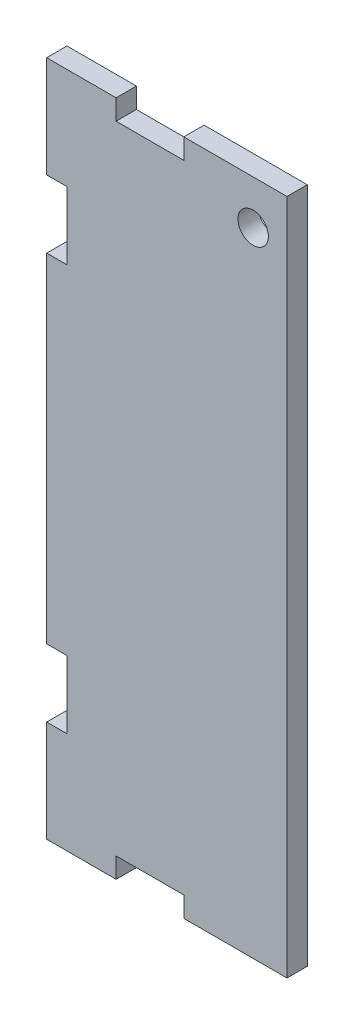
ISO-10303-21;
HEADER;
FILE_DESCRIPTION(('STEP AP214'),'2;1');
FILE_NAME('part.step','',(''),(''),'','','');
FILE_SCHEMA(('AUTOMOTIVE_DESIGN { 1 0 10303 214 1 1 1 1 }'));
ENDSEC;
DATA;
#1=APPLICATION_CONTEXT('core data for automotive mechanical design processes');
#2=APPLICATION_PROTOCOL_DEFINITION('international standard','automotive_design',2000,#1);
#3=PRODUCT_CONTEXT('',#1,'mechanical');
#4=PRODUCT('Part','Part','',(#3));
#5=PRODUCT_RELATED_PRODUCT_CATEGORY('part','',(#4));
#6=PRODUCT_DEFINITION_FORMATION('','',#4);
#7=PRODUCT_DEFINITION_CONTEXT('part definition',#1,'design');
#8=PRODUCT_DEFINITION('design','',#6,#7);
#9=PRODUCT_DEFINITION_SHAPE('','',#8);
#10=(LENGTH_UNIT() NAMED_UNIT(*) SI_UNIT(.MILLI.,.METRE.));
#11=(NAMED_UNIT(*) PLANE_ANGLE_UNIT() SI_UNIT($,.RADIAN.));
#12=(NAMED_UNIT(*) SI_UNIT($,.STERADIAN.) SOLID_ANGLE_UNIT());
#13=UNCERTAINTY_MEASURE_WITH_UNIT(LENGTH_MEASURE(1.E-05),#10,'distance_accuracy_value','');
#14=(GEOMETRIC_REPRESENTATION_CONTEXT(3) GLOBAL_UNCERTAINTY_ASSIGNED_CONTEXT((#13)) GLOBAL_UNIT_ASSIGNED_CONTEXT((#10,
#11,#12)) REPRESENTATION_CONTEXT('',''));
#15=CARTESIAN_POINT('',(0.,0.,0.));
#16=DIRECTION('',(0.,0.,1.));
#17=DIRECTION('',(1.,0.,0.));
#18=AXIS2_PLACEMENT_3D('',#15,#16,#17);
#19=CARTESIAN_POINT('',(0.,-47.,3.));
#20=DIRECTION('',(0.,1.,0.));
#21=DIRECTION('',(0.,0.,1.));
#22=AXIS2_PLACEMENT_3D('',#19,#20,#21);
#23=PLANE('',#22);
#24=DIRECTION('',(1.,0.,0.));
#25=VECTOR('',#24,1.);
#26=CARTESIAN_POINT('',(0.,-47.,0.));
#27=LINE('',#26,#25);
#28=CARTESIAN_POINT('',(-5.,-47.,0.));
#29=VERTEX_POINT('',#28);
#30=CARTESIAN_POINT('',(5.,-47.,0.));
#31=VERTEX_POINT('',#30);
#32=EDGE_CURVE('E229',#29,#31,#27,.T.);
#33=ORIENTED_EDGE('',*,*,#32,.T.);
#34=DIRECTION('',(0.,0.,-1.));
#35=VECTOR('',#34,1.);
#36=CARTESIAN_POINT('',(5.,-47.,3.));
#37=LINE('',#36,#35);
#38=CARTESIAN_POINT('',(5.,-47.,3.));
#39=VERTEX_POINT('',#38);
#40=EDGE_CURVE('E11',#39,#31,#37,.T.);
#41=ORIENTED_EDGE('',*,*,#40,.F.);
#42=DIRECTION('',(1.,0.,0.));
#43=VECTOR('',#42,1.);
#44=CARTESIAN_POINT('',(0.,-47.,3.));
#45=LINE('',#44,#43);
#46=CARTESIAN_POINT('',(-5.,-47.,3.));
#47=VERTEX_POINT('',#46);
#48=EDGE_CURVE('E221',#47,#39,#45,.T.);
#49=ORIENTED_EDGE('',*,*,#48,.F.);
#50=DIRECTION('',(0.,0.,-1.));
#51=VECTOR('',#50,1.);
#52=CARTESIAN_POINT('',(-5.,-47.,3.));
#53=LINE('',#52,#51);
#54=EDGE_CURVE('E205',#47,#29,#53,.T.);
#55=ORIENTED_EDGE('',*,*,#54,.T.);
#56=EDGE_LOOP('',(#33,#41,#49,#55));
#57=FACE_BOUND('',#56,.T.);
#58=ADVANCED_FACE('F41',(#57),#23,.F.);
#59=CARTESIAN_POINT('',(4.99999999999997,0.,3.));
#60=DIRECTION('',(1.,0.,0.));
#61=DIRECTION('',(0.,1.,0.));
#62=AXIS2_PLACEMENT_3D('',#59,#60,#61);
#63=PLANE('',#62);
#64=DIRECTION('',(0.,-1.,0.));
#65=VECTOR('',#64,1.);
#66=CARTESIAN_POINT('',(4.99999999999997,0.,0.));
#67=LINE('',#66,#65);
#68=CARTESIAN_POINT('',(5.,-50.,0.));
#69=VERTEX_POINT('',#68);
#70=EDGE_CURVE('E282',#31,#69,#67,.T.);
#71=ORIENTED_EDGE('',*,*,#70,.T.);
#72=DIRECTION('',(0.,0.,-1.));
#73=VECTOR('',#72,1.);
#74=CARTESIAN_POINT('',(5.,-50.,3.));
#75=LINE('',#74,#73);
#76=CARTESIAN_POINT('',(5.,-50.,3.));
#77=VERTEX_POINT('',#76);
#78=EDGE_CURVE('E50',#77,#69,#75,.T.);
#79=ORIENTED_EDGE('',*,*,#78,.F.);
#80=DIRECTION('',(0.,-1.,0.));
#81=VECTOR('',#80,1.);
#82=CARTESIAN_POINT('',(4.99999999999997,0.,3.));
#83=LINE('',#82,#81);
#84=EDGE_CURVE('E132',#39,#77,#83,.T.);
#85=ORIENTED_EDGE('',*,*,#84,.F.);
#86=ORIENTED_EDGE('',*,*,#40,.T.);
#87=EDGE_LOOP('',(#71,#79,#85,#86));
#88=FACE_BOUND('',#87,.T.);
#89=ADVANCED_FACE('F271',(#88),#63,.F.);
#90=CARTESIAN_POINT('',(0.,-50.,3.));
#91=DIRECTION('',(0.,1.,0.));
#92=DIRECTION('',(0.,0.,1.));
#93=AXIS2_PLACEMENT_3D('',#90,#91,#92);
#94=PLANE('',#93);
#95=DIRECTION('',(1.,0.,0.));
#96=VECTOR('',#95,1.);
#97=CARTESIAN_POINT('',(0.,-50.,0.));
#98=LINE('',#97,#96);
#99=CARTESIAN_POINT('',(20.25,-50.,0.));
#100=VERTEX_POINT('',#99);
#101=EDGE_CURVE('E285',#69,#100,#98,.T.);
#102=ORIENTED_EDGE('',*,*,#101,.T.);
#103=DIRECTION('',(0.,0.,-1.));
#104=VECTOR('',#103,1.);
#105=CARTESIAN_POINT('',(20.25,-50.,3.));
#106=LINE('',#105,#104);
#107=CARTESIAN_POINT('',(20.25,-50.,3.));
#108=VERTEX_POINT('',#107);
#109=EDGE_CURVE('E225',#108,#100,#106,.T.);
#110=ORIENTED_EDGE('',*,*,#109,.F.);
#111=DIRECTION('',(1.,0.,0.));
#112=VECTOR('',#111,1.);
#113=CARTESIAN_POINT('',(0.,-50.,3.));
#114=LINE('',#113,#112);
#115=EDGE_CURVE('E203',#77,#108,#114,.T.);
#116=ORIENTED_EDGE('',*,*,#115,.F.);
#117=ORIENTED_EDGE('',*,*,#78,.T.);
#118=EDGE_LOOP('',(#102,#110,#116,#117));
#119=FACE_BOUND('',#118,.T.);
#120=ADVANCED_FACE('F276',(#119),#94,.F.);
#121=CARTESIAN_POINT('',(0.,50.,3.));
#122=DIRECTION('',(0.,1.,0.));
#123=DIRECTION('',(0.,0.,1.));
#124=AXIS2_PLACEMENT_3D('',#121,#122,#123);
#125=PLANE('',#124);
#126=DIRECTION('',(1.,0.,0.));
#127=VECTOR('',#126,1.);
#128=CARTESIAN_POINT('',(0.,50.,0.));
#129=LINE('',#128,#127);
#130=CARTESIAN_POINT('',(5.,50.,0.));
#131=VERTEX_POINT('',#130);
#132=CARTESIAN_POINT('',(20.25,50.,0.));
#133=VERTEX_POINT('',#132);
#134=EDGE_CURVE('E292',#131,#133,#129,.T.);
#135=ORIENTED_EDGE('',*,*,#134,.F.);
#136=DIRECTION('',(0.,0.,-1.));
#137=VECTOR('',#136,1.);
#138=CARTESIAN_POINT('',(5.,50.,3.));
#139=LINE('',#138,#137);
#140=CARTESIAN_POINT('',(5.,50.,3.));
#141=VERTEX_POINT('',#140);
#142=EDGE_CURVE('E379',#141,#131,#139,.T.);
#143=ORIENTED_EDGE('',*,*,#142,.F.);
#144=DIRECTION('',(1.,0.,0.));
#145=VECTOR('',#144,1.);
#146=CARTESIAN_POINT('',(0.,50.,3.));
#147=LINE('',#146,#145);
#148=CARTESIAN_POINT('',(20.25,50.,3.));
#149=VERTEX_POINT('',#148);
#150=EDGE_CURVE('E211',#141,#149,#147,.T.);
#151=ORIENTED_EDGE('',*,*,#150,.T.);
#152=DIRECTION('',(0.,0.,-1.));
#153=VECTOR('',#152,1.);
#154=CARTESIAN_POINT('',(20.25,50.,3.));
#155=LINE('',#154,#153);
#156=EDGE_CURVE('E230',#149,#133,#155,.T.);
#157=ORIENTED_EDGE('',*,*,#156,.T.);
#158=EDGE_LOOP('',(#135,#143,#151,#157));
#159=FACE_BOUND('',#158,.T.);
#160=ADVANCED_FACE('F392',(#159),#125,.T.);
#161=CARTESIAN_POINT('',(4.99999999999994,0.,3.));
#162=DIRECTION('',(-1.,0.,0.));
#163=DIRECTION('',(0.,-1.,0.));
#164=AXIS2_PLACEMENT_3D('',#161,#162,#163);
#165=PLANE('',#164);
#166=DIRECTION('',(0.,1.,0.));
#167=VECTOR('',#166,1.);
#168=CARTESIAN_POINT('',(4.99999999999994,0.,0.));
#169=LINE('',#168,#167);
#170=CARTESIAN_POINT('',(5.,47.,0.));
#171=VERTEX_POINT('',#170);
#172=EDGE_CURVE('E296',#171,#131,#169,.T.);
#173=ORIENTED_EDGE('',*,*,#172,.F.);
#174=DIRECTION('',(0.,0.,-1.));
#175=VECTOR('',#174,1.);
#176=CARTESIAN_POINT('',(5.,47.,3.));
#177=LINE('',#176,#175);
#178=CARTESIAN_POINT('',(5.,47.,3.));
#179=VERTEX_POINT('',#178);
#180=EDGE_CURVE('E376',#179,#171,#177,.T.);
#181=ORIENTED_EDGE('',*,*,#180,.F.);
#182=DIRECTION('',(0.,1.,0.));
#183=VECTOR('',#182,1.);
#184=CARTESIAN_POINT('',(4.99999999999994,0.,3.));
#185=LINE('',#184,#183);
#186=EDGE_CURVE('E219',#179,#141,#185,.T.);
#187=ORIENTED_EDGE('',*,*,#186,.T.);
#188=ORIENTED_EDGE('',*,*,#142,.T.);
#189=EDGE_LOOP('',(#173,#181,#187,#188));
#190=FACE_BOUND('',#189,.T.);
#191=ADVANCED_FACE('F402',(#190),#165,.T.);
#192=CARTESIAN_POINT('',(0.,47.,3.));
#193=DIRECTION('',(0.,1.,0.));
#194=DIRECTION('',(-1.,0.,0.));
#195=AXIS2_PLACEMENT_3D('',#192,#193,#194);
#196=PLANE('',#195);
#197=DIRECTION('',(1.,0.,0.));
#198=VECTOR('',#197,1.);
#199=CARTESIAN_POINT('',(0.,47.,0.));
#200=LINE('',#199,#198);
#201=CARTESIAN_POINT('',(-5.,47.,0.));
#202=VERTEX_POINT('',#201);
#203=EDGE_CURVE('E301',#202,#171,#200,.T.);
#204=ORIENTED_EDGE('',*,*,#203,.F.);
#205=DIRECTION('',(0.,0.,-1.));
#206=VECTOR('',#205,1.);
#207=CARTESIAN_POINT('',(-5.,47.,3.));
#208=LINE('',#207,#206);
#209=CARTESIAN_POINT('',(-5.,47.,3.));
#210=VERTEX_POINT('',#209);
#211=EDGE_CURVE('E373',#210,#202,#208,.T.);
#212=ORIENTED_EDGE('',*,*,#211,.F.);
#213=DIRECTION('',(1.,0.,0.));
#214=VECTOR('',#213,1.);
#215=CARTESIAN_POINT('',(0.,47.,3.));
#216=LINE('',#215,#214);
#217=EDGE_CURVE('E404',#210,#179,#216,.T.);
#218=ORIENTED_EDGE('',*,*,#217,.T.);
#219=ORIENTED_EDGE('',*,*,#180,.T.);
#220=EDGE_LOOP('',(#204,#212,#218,#219));
#221=FACE_BOUND('',#220,.T.);
#222=ADVANCED_FACE('F499',(#221),#196,.T.);
#223=CARTESIAN_POINT('',(-5.00000000000006,0.,3.));
#224=DIRECTION('',(1.,0.,0.));
#225=DIRECTION('',(0.,1.,0.));
#226=AXIS2_PLACEMENT_3D('',#223,#224,#225);
#227=PLANE('',#226);
#228=DIRECTION('',(0.,-1.,0.));
#229=VECTOR('',#228,1.);
#230=CARTESIAN_POINT('',(-5.00000000000006,0.,0.));
#231=LINE('',#230,#229);
#232=CARTESIAN_POINT('',(-5.,50.,0.));
#233=VERTEX_POINT('',#232);
#234=EDGE_CURVE('E305',#233,#202,#231,.T.);
#235=ORIENTED_EDGE('',*,*,#234,.F.);
#236=DIRECTION('',(0.,0.,-1.));
#237=VECTOR('',#236,1.);
#238=CARTESIAN_POINT('',(-5.,50.,3.));
#239=LINE('',#238,#237);
#240=CARTESIAN_POINT('',(-5.,50.,3.));
#241=VERTEX_POINT('',#240);
#242=EDGE_CURVE('E370',#241,#233,#239,.T.);
#243=ORIENTED_EDGE('',*,*,#242,.F.);
#244=DIRECTION('',(0.,-1.,0.));
#245=VECTOR('',#244,1.);
#246=CARTESIAN_POINT('',(-5.00000000000006,0.,3.));
#247=LINE('',#246,#245);
#248=EDGE_CURVE('E407',#241,#210,#247,.T.);
#249=ORIENTED_EDGE('',*,*,#248,.T.);
#250=ORIENTED_EDGE('',*,*,#211,.T.);
#251=EDGE_LOOP('',(#235,#243,#249,#250));
#252=FACE_BOUND('',#251,.T.);
#253=ADVANCED_FACE('F441',(#252),#227,.T.);
#254=CARTESIAN_POINT('',(-15.25,50.,0.));
#255=VERTEX_POINT('',#254);
#256=EDGE_CURVE('E297',#255,#233,#129,.T.);
#257=ORIENTED_EDGE('',*,*,#256,.F.);
#258=DIRECTION('',(0.,0.,-1.));
#259=VECTOR('',#258,1.);
#260=CARTESIAN_POINT('',(-15.25,50.,3.));
#261=LINE('',#260,#259);
#262=CARTESIAN_POINT('',(-15.25,50.,3.));
#263=VERTEX_POINT('',#262);
#264=EDGE_CURVE('E367',#263,#255,#261,.T.);
#265=ORIENTED_EDGE('',*,*,#264,.F.);
#266=EDGE_CURVE('E220',#263,#241,#147,.T.);
#267=ORIENTED_EDGE('',*,*,#266,.T.);
#268=ORIENTED_EDGE('',*,*,#242,.T.);
#269=EDGE_LOOP('',(#257,#265,#267,#268));
#270=FACE_BOUND('',#269,.T.);
#271=ADVANCED_FACE('F435',(#270),#125,.T.);
#272=CARTESIAN_POINT('',(-15.25,0.,3.));
#273=DIRECTION('',(1.,0.,0.));
#274=DIRECTION('',(0.,1.,0.));
#275=AXIS2_PLACEMENT_3D('',#272,#273,#274);
#276=PLANE('',#275);
#277=DIRECTION('',(0.,-1.,0.));
#278=VECTOR('',#277,1.);
#279=CARTESIAN_POINT('',(-15.25,0.,0.));
#280=LINE('',#279,#278);
#281=CARTESIAN_POINT('',(-15.25,35.,0.));
#282=VERTEX_POINT('',#281);
#283=EDGE_CURVE('E309',#255,#282,#280,.T.);
#284=ORIENTED_EDGE('',*,*,#283,.T.);
#285=DIRECTION('',(0.,0.,-1.));
#286=VECTOR('',#285,1.);
#287=CARTESIAN_POINT('',(-15.25,35.,3.));
#288=LINE('',#287,#286);
#289=CARTESIAN_POINT('',(-15.25,35.,3.));
#290=VERTEX_POINT('',#289);
#291=EDGE_CURVE('E363',#290,#282,#288,.T.);
#292=ORIENTED_EDGE('',*,*,#291,.F.);
#293=DIRECTION('',(0.,-1.,0.));
#294=VECTOR('',#293,1.);
#295=CARTESIAN_POINT('',(-15.25,0.,3.));
#296=LINE('',#295,#294);
#297=EDGE_CURVE('E191',#263,#290,#296,.T.);
#298=ORIENTED_EDGE('',*,*,#297,.F.);
#299=ORIENTED_EDGE('',*,*,#264,.T.);
#300=EDGE_LOOP('',(#284,#292,#298,#299));
#301=FACE_BOUND('',#300,.T.);
#302=ADVANCED_FACE('F477',(#301),#276,.F.);
#303=CARTESIAN_POINT('',(0.,35.,3.));
#304=DIRECTION('',(0.,1.,0.));
#305=DIRECTION('',(0.,0.,1.));
#306=AXIS2_PLACEMENT_3D('',#303,#304,#305);
#307=PLANE('',#306);
#308=DIRECTION('',(1.,0.,0.));
#309=VECTOR('',#308,1.);
#310=CARTESIAN_POINT('',(0.,35.,0.));
#311=LINE('',#310,#309);
#312=CARTESIAN_POINT('',(-12.25,35.,0.));
#313=VERTEX_POINT('',#312);
#314=EDGE_CURVE('E312',#282,#313,#311,.T.);
#315=ORIENTED_EDGE('',*,*,#314,.T.);
#316=DIRECTION('',(0.,0.,-1.));
#317=VECTOR('',#316,1.);
#318=CARTESIAN_POINT('',(-12.25,35.,3.));
#319=LINE('',#318,#317);
#320=CARTESIAN_POINT('',(-12.25,35.,3.));
#321=VERTEX_POINT('',#320);
#322=EDGE_CURVE('E359',#321,#313,#319,.T.);
#323=ORIENTED_EDGE('',*,*,#322,.F.);
#324=DIRECTION('',(1.,0.,0.));
#325=VECTOR('',#324,1.);
#326=CARTESIAN_POINT('',(0.,35.,3.));
#327=LINE('',#326,#325);
#328=EDGE_CURVE('E414',#290,#321,#327,.T.);
#329=ORIENTED_EDGE('',*,*,#328,.F.);
#330=ORIENTED_EDGE('',*,*,#291,.T.);
#331=EDGE_LOOP('',(#315,#323,#329,#330));
#332=FACE_BOUND('',#331,.T.);
#333=ADVANCED_FACE('F490',(#332),#307,.F.);
#334=CARTESIAN_POINT('',(-12.25,0.,3.));
#335=DIRECTION('',(1.,0.,0.));
#336=DIRECTION('',(0.,1.,0.));
#337=AXIS2_PLACEMENT_3D('',#334,#335,#336);
#338=PLANE('',#337);
#339=DIRECTION('',(0.,-1.,0.));
#340=VECTOR('',#339,1.);
#341=CARTESIAN_POINT('',(-12.25,0.,0.));
#342=LINE('',#341,#340);
#343=CARTESIAN_POINT('',(-12.25,25.,0.));
#344=VERTEX_POINT('',#343);
#345=EDGE_CURVE('E316',#313,#344,#342,.T.);
#346=ORIENTED_EDGE('',*,*,#345,.T.);
#347=DIRECTION('',(0.,0.,-1.));
#348=VECTOR('',#347,1.);
#349=CARTESIAN_POINT('',(-12.25,25.,3.));
#350=LINE('',#349,#348);
#351=CARTESIAN_POINT('',(-12.25,25.,3.));
#352=VERTEX_POINT('',#351);
#353=EDGE_CURVE('E355',#352,#344,#350,.T.);
#354=ORIENTED_EDGE('',*,*,#353,.F.);
#355=DIRECTION('',(0.,-1.,0.));
#356=VECTOR('',#355,1.);
#357=CARTESIAN_POINT('',(-12.25,0.,3.));
#358=LINE('',#357,#356);
#359=EDGE_CURVE('E417',#321,#352,#358,.T.);
#360=ORIENTED_EDGE('',*,*,#359,.F.);
#361=ORIENTED_EDGE('',*,*,#322,.T.);
#362=EDGE_LOOP('',(#346,#354,#360,#361));
#363=FACE_BOUND('',#362,.T.);
#364=ADVANCED_FACE('F486',(#363),#338,.F.);
#365=CARTESIAN_POINT('',(0.,25.,3.));
#366=DIRECTION('',(0.,-1.,0.));
#367=DIRECTION('',(0.,0.,-1.));
#368=AXIS2_PLACEMENT_3D('',#365,#366,#367);
#369=PLANE('',#368);
#370=DIRECTION('',(-1.,0.,0.));
#371=VECTOR('',#370,1.);
#372=CARTESIAN_POINT('',(0.,25.,0.));
#373=LINE('',#372,#371);
#374=CARTESIAN_POINT('',(-15.25,25.,0.));
#375=VERTEX_POINT('',#374);
#376=EDGE_CURVE('E319',#344,#375,#373,.T.);
#377=ORIENTED_EDGE('',*,*,#376,.T.);
#378=DIRECTION('',(0.,0.,-1.));
#379=VECTOR('',#378,1.);
#380=CARTESIAN_POINT('',(-15.25,25.,3.));
#381=LINE('',#380,#379);
#382=CARTESIAN_POINT('',(-15.25,25.,3.));
#383=VERTEX_POINT('',#382);
#384=EDGE_CURVE('E351',#383,#375,#381,.T.);
#385=ORIENTED_EDGE('',*,*,#384,.F.);
#386=DIRECTION('',(-1.,0.,0.));
#387=VECTOR('',#386,1.);
#388=CARTESIAN_POINT('',(0.,25.,3.));
#389=LINE('',#388,#387);
#390=EDGE_CURVE('E420',#352,#383,#389,.T.);
#391=ORIENTED_EDGE('',*,*,#390,.F.);
#392=ORIENTED_EDGE('',*,*,#353,.T.);
#393=EDGE_LOOP('',(#377,#385,#391,#392));
#394=FACE_BOUND('',#393,.T.);
#395=ADVANCED_FACE('F483',(#394),#369,.F.);
#396=CARTESIAN_POINT('',(-15.25,-25.,0.));
#397=VERTEX_POINT('',#396);
#398=EDGE_CURVE('E313',#375,#397,#280,.T.);
#399=ORIENTED_EDGE('',*,*,#398,.T.);
#400=DIRECTION('',(0.,0.,-1.));
#401=VECTOR('',#400,1.);
#402=CARTESIAN_POINT('',(-15.25,-25.,3.));
#403=LINE('',#402,#401);
#404=CARTESIAN_POINT('',(-15.25,-25.,3.));
#405=VERTEX_POINT('',#404);
#406=EDGE_CURVE('E347',#405,#397,#403,.T.);
#407=ORIENTED_EDGE('',*,*,#406,.F.);
#408=EDGE_CURVE('E190',#383,#405,#296,.T.);
#409=ORIENTED_EDGE('',*,*,#408,.F.);
#410=ORIENTED_EDGE('',*,*,#384,.T.);
#411=EDGE_LOOP('',(#399,#407,#409,#410));
#412=FACE_BOUND('',#411,.T.);
#413=ADVANCED_FACE('F453',(#412),#276,.F.);
#414=CARTESIAN_POINT('',(0.,-25.,3.));
#415=DIRECTION('',(0.,1.,0.));
#416=DIRECTION('',(0.,0.,1.));
#417=AXIS2_PLACEMENT_3D('',#414,#415,#416);
#418=PLANE('',#417);
#419=DIRECTION('',(1.,0.,0.));
#420=VECTOR('',#419,1.);
#421=CARTESIAN_POINT('',(0.,-25.,0.));
#422=LINE('',#421,#420);
#423=CARTESIAN_POINT('',(-12.25,-25.,0.));
#424=VERTEX_POINT('',#423);
#425=EDGE_CURVE('E322',#397,#424,#422,.T.);
#426=ORIENTED_EDGE('',*,*,#425,.T.);
#427=DIRECTION('',(0.,0.,-1.));
#428=VECTOR('',#427,1.);
#429=CARTESIAN_POINT('',(-12.25,-25.,3.));
#430=LINE('',#429,#428);
#431=CARTESIAN_POINT('',(-12.25,-25.,3.));
#432=VERTEX_POINT('',#431);
#433=EDGE_CURVE('E343',#432,#424,#430,.T.);
#434=ORIENTED_EDGE('',*,*,#433,.F.);
#435=DIRECTION('',(1.,0.,0.));
#436=VECTOR('',#435,1.);
#437=CARTESIAN_POINT('',(0.,-25.,3.));
#438=LINE('',#437,#436);
#439=EDGE_CURVE('E423',#405,#432,#438,.T.);
#440=ORIENTED_EDGE('',*,*,#439,.F.);
#441=ORIENTED_EDGE('',*,*,#406,.T.);
#442=EDGE_LOOP('',(#426,#434,#440,#441));
#443=FACE_BOUND('',#442,.T.);
#444=ADVANCED_FACE('F460',(#443),#418,.F.);
#445=CARTESIAN_POINT('',(-12.25,0.,3.));
#446=DIRECTION('',(1.,0.,0.));
#447=DIRECTION('',(0.,1.,0.));
#448=AXIS2_PLACEMENT_3D('',#445,#446,#447);
#449=PLANE('',#448);
#450=DIRECTION('',(0.,-1.,0.));
#451=VECTOR('',#450,1.);
#452=CARTESIAN_POINT('',(-12.25,0.,0.));
#453=LINE('',#452,#451);
#454=CARTESIAN_POINT('',(-12.25,-35.,0.));
#455=VERTEX_POINT('',#454);
#456=EDGE_CURVE('E325',#424,#455,#453,.T.);
#457=ORIENTED_EDGE('',*,*,#456,.T.);
#458=DIRECTION('',(0.,0.,-1.));
#459=VECTOR('',#458,1.);
#460=CARTESIAN_POINT('',(-12.25,-35.,3.));
#461=LINE('',#460,#459);
#462=CARTESIAN_POINT('',(-12.25,-35.,3.));
#463=VERTEX_POINT('',#462);
#464=EDGE_CURVE('E339',#463,#455,#461,.T.);
#465=ORIENTED_EDGE('',*,*,#464,.F.);
#466=DIRECTION('',(0.,-1.,0.));
#467=VECTOR('',#466,1.);
#468=CARTESIAN_POINT('',(-12.25,0.,3.));
#469=LINE('',#468,#467);
#470=EDGE_CURVE('E426',#432,#463,#469,.T.);
#471=ORIENTED_EDGE('',*,*,#470,.F.);
#472=ORIENTED_EDGE('',*,*,#433,.T.);
#473=EDGE_LOOP('',(#457,#465,#471,#472));
#474=FACE_BOUND('',#473,.T.);
#475=ADVANCED_FACE('F466',(#474),#449,.F.);
#476=CARTESIAN_POINT('',(0.,-35.,3.));
#477=DIRECTION('',(0.,-1.,0.));
#478=DIRECTION('',(0.,0.,-1.));
#479=AXIS2_PLACEMENT_3D('',#476,#477,#478);
#480=PLANE('',#479);
#481=DIRECTION('',(-1.,0.,0.));
#482=VECTOR('',#481,1.);
#483=CARTESIAN_POINT('',(0.,-35.,0.));
#484=LINE('',#483,#482);
#485=CARTESIAN_POINT('',(-15.25,-35.,0.));
#486=VERTEX_POINT('',#485);
#487=EDGE_CURVE('E328',#455,#486,#484,.T.);
#488=ORIENTED_EDGE('',*,*,#487,.T.);
#489=DIRECTION('',(0.,0.,-1.));
#490=VECTOR('',#489,1.);
#491=CARTESIAN_POINT('',(-15.25,-35.,3.));
#492=LINE('',#491,#490);
#493=CARTESIAN_POINT('',(-15.25,-35.,3.));
#494=VERTEX_POINT('',#493);
#495=EDGE_CURVE('E197',#494,#486,#492,.T.);
#496=ORIENTED_EDGE('',*,*,#495,.F.);
#497=DIRECTION('',(-1.,0.,0.));
#498=VECTOR('',#497,1.);
#499=CARTESIAN_POINT('',(0.,-35.,3.));
#500=LINE('',#499,#498);
#501=EDGE_CURVE('E184',#463,#494,#500,.T.);
#502=ORIENTED_EDGE('',*,*,#501,.F.);
#503=ORIENTED_EDGE('',*,*,#464,.T.);
#504=EDGE_LOOP('',(#488,#496,#502,#503));
#505=FACE_BOUND('',#504,.T.);
#506=ADVANCED_FACE('F469',(#505),#480,.F.);
#507=CARTESIAN_POINT('',(-15.25,-50.,0.));
#508=VERTEX_POINT('',#507);
#509=EDGE_CURVE('E195',#486,#508,#280,.T.);
#510=ORIENTED_EDGE('',*,*,#509,.T.);
#511=DIRECTION('',(0.,0.,-1.));
#512=VECTOR('',#511,1.);
#513=CARTESIAN_POINT('',(-15.25,-50.,3.));
#514=LINE('',#513,#512);
#515=CARTESIAN_POINT('',(-15.25,-50.,3.));
#516=VERTEX_POINT('',#515);
#517=EDGE_CURVE('E192',#516,#508,#514,.T.);
#518=ORIENTED_EDGE('',*,*,#517,.F.);
#519=EDGE_CURVE('E178',#494,#516,#296,.T.);
#520=ORIENTED_EDGE('',*,*,#519,.F.);
#521=ORIENTED_EDGE('',*,*,#495,.T.);
#522=EDGE_LOOP('',(#510,#518,#520,#521));
#523=FACE_BOUND('',#522,.T.);
#524=ADVANCED_FACE('F193',(#523),#276,.F.);
#525=CARTESIAN_POINT('',(-5.,-50.,0.));
#526=VERTEX_POINT('',#525);
#527=EDGE_CURVE('E118',#508,#526,#98,.T.);
#528=ORIENTED_EDGE('',*,*,#527,.T.);
#529=DIRECTION('',(0.,0.,-1.));
#530=VECTOR('',#529,1.);
#531=CARTESIAN_POINT('',(-5.,-50.,3.));
#532=LINE('',#531,#530);
#533=CARTESIAN_POINT('',(-5.,-50.,3.));
#534=VERTEX_POINT('',#533);
#535=EDGE_CURVE('E198',#534,#526,#532,.T.);
#536=ORIENTED_EDGE('',*,*,#535,.F.);
#537=EDGE_CURVE('E182',#516,#534,#114,.T.);
#538=ORIENTED_EDGE('',*,*,#537,.F.);
#539=ORIENTED_EDGE('',*,*,#517,.T.);
#540=EDGE_LOOP('',(#528,#536,#538,#539));
#541=FACE_BOUND('',#540,.T.);
#542=ADVANCED_FACE('F200',(#541),#94,.F.);
#543=CARTESIAN_POINT('',(-5.,0.,3.));
#544=DIRECTION('',(-1.,0.,0.));
#545=DIRECTION('',(0.,0.,1.));
#546=AXIS2_PLACEMENT_3D('',#543,#544,#545);
#547=PLANE('',#546);
#548=DIRECTION('',(0.,1.,0.));
#549=VECTOR('',#548,1.);
#550=CARTESIAN_POINT('',(-5.,0.,0.));
#551=LINE('',#550,#549);
#552=EDGE_CURVE('E124',#526,#29,#551,.T.);
#553=ORIENTED_EDGE('',*,*,#552,.T.);
#554=ORIENTED_EDGE('',*,*,#54,.F.);
#555=DIRECTION('',(0.,1.,0.));
#556=VECTOR('',#555,1.);
#557=CARTESIAN_POINT('',(-5.,0.,3.));
#558=LINE('',#557,#556);
#559=EDGE_CURVE('E58',#534,#47,#558,.T.);
#560=ORIENTED_EDGE('',*,*,#559,.F.);
#561=ORIENTED_EDGE('',*,*,#535,.T.);
#562=EDGE_LOOP('',(#553,#554,#560,#561));
#563=FACE_BOUND('',#562,.T.);
#564=ADVANCED_FACE('F261',(#563),#547,.F.);
#565=CARTESIAN_POINT('',(0.,0.,3.));
#566=DIRECTION('',(0.,0.,1.));
#567=DIRECTION('',(1.,0.,0.));
#568=AXIS2_PLACEMENT_3D('',#565,#566,#567);
#569=PLANE('',#568);
#570=CARTESIAN_POINT('',(15.25,43.5,3.));
#571=DIRECTION('',(0.,0.,1.));
#572=DIRECTION('',(1.,0.,0.));
#573=AXIS2_PLACEMENT_3D('',#570,#571,#572);
#574=CIRCLE('',#573,2.25);
#575=CARTESIAN_POINT('',(17.5,43.5,3.));
#576=VERTEX_POINT('',#575);
#577=EDGE_CURVE('E242',#576,#576,#574,.T.);
#578=ORIENTED_EDGE('',*,*,#577,.F.);
#579=EDGE_LOOP('',(#578));
#580=FACE_BOUND('',#579,.T.);
#581=ORIENTED_EDGE('',*,*,#48,.T.);
#582=ORIENTED_EDGE('',*,*,#84,.T.);
#583=ORIENTED_EDGE('',*,*,#115,.T.);
#584=DIRECTION('',(0.,1.,0.));
#585=VECTOR('',#584,1.);
#586=CARTESIAN_POINT('',(20.25,-50.,3.));
#587=LINE('',#586,#585);
#588=EDGE_CURVE('E234',#108,#149,#587,.T.);
#589=ORIENTED_EDGE('',*,*,#588,.T.);
#590=ORIENTED_EDGE('',*,*,#150,.F.);
#591=ORIENTED_EDGE('',*,*,#186,.F.);
#592=ORIENTED_EDGE('',*,*,#217,.F.);
#593=ORIENTED_EDGE('',*,*,#248,.F.);
#594=ORIENTED_EDGE('',*,*,#266,.F.);
#595=ORIENTED_EDGE('',*,*,#297,.T.);
#596=ORIENTED_EDGE('',*,*,#328,.T.);
#597=ORIENTED_EDGE('',*,*,#359,.T.);
#598=ORIENTED_EDGE('',*,*,#390,.T.);
#599=ORIENTED_EDGE('',*,*,#408,.T.);
#600=ORIENTED_EDGE('',*,*,#439,.T.);
#601=ORIENTED_EDGE('',*,*,#470,.T.);
#602=ORIENTED_EDGE('',*,*,#501,.T.);
#603=ORIENTED_EDGE('',*,*,#519,.T.);
#604=ORIENTED_EDGE('',*,*,#537,.T.);
#605=ORIENTED_EDGE('',*,*,#559,.T.);
#606=EDGE_LOOP('',(#581,#582,#583,#589,#590,#591,#592,#593,#594,#595,#596,#597,#598,#599,#600,
#601,#602,#603,#604,#605));
#607=FACE_BOUND('',#606,.T.);
#608=ADVANCED_FACE('F180',(#580,#607),#569,.T.);
#609=CARTESIAN_POINT('',(0.,0.,0.));
#610=DIRECTION('',(0.,0.,1.));
#611=DIRECTION('',(1.,0.,0.));
#612=AXIS2_PLACEMENT_3D('',#609,#610,#611);
#613=PLANE('',#612);
#614=CARTESIAN_POINT('',(15.25,43.5,0.));
#615=DIRECTION('',(0.,0.,1.));
#616=DIRECTION('',(1.,0.,0.));
#617=AXIS2_PLACEMENT_3D('',#614,#615,#616);
#618=CIRCLE('',#617,2.25);
#619=CARTESIAN_POINT('',(17.5,43.5,0.));
#620=VERTEX_POINT('',#619);
#621=EDGE_CURVE('E239',#620,#620,#618,.T.);
#622=ORIENTED_EDGE('',*,*,#621,.T.);
#623=EDGE_LOOP('',(#622));
#624=FACE_BOUND('',#623,.T.);
#625=ORIENTED_EDGE('',*,*,#32,.F.);
#626=ORIENTED_EDGE('',*,*,#552,.F.);
#627=ORIENTED_EDGE('',*,*,#527,.F.);
#628=ORIENTED_EDGE('',*,*,#509,.F.);
#629=ORIENTED_EDGE('',*,*,#487,.F.);
#630=ORIENTED_EDGE('',*,*,#456,.F.);
#631=ORIENTED_EDGE('',*,*,#425,.F.);
#632=ORIENTED_EDGE('',*,*,#398,.F.);
#633=ORIENTED_EDGE('',*,*,#376,.F.);
#634=ORIENTED_EDGE('',*,*,#345,.F.);
#635=ORIENTED_EDGE('',*,*,#314,.F.);
#636=ORIENTED_EDGE('',*,*,#283,.F.);
#637=ORIENTED_EDGE('',*,*,#256,.T.);
#638=ORIENTED_EDGE('',*,*,#234,.T.);
#639=ORIENTED_EDGE('',*,*,#203,.T.);
#640=ORIENTED_EDGE('',*,*,#172,.T.);
#641=ORIENTED_EDGE('',*,*,#134,.T.);
#642=DIRECTION('',(0.,1.,0.));
#643=VECTOR('',#642,1.);
#644=CARTESIAN_POINT('',(20.25,-50.,0.));
#645=LINE('',#644,#643);
#646=EDGE_CURVE('E235',#100,#133,#645,.T.);
#647=ORIENTED_EDGE('',*,*,#646,.F.);
#648=ORIENTED_EDGE('',*,*,#101,.F.);
#649=ORIENTED_EDGE('',*,*,#70,.F.);
#650=EDGE_LOOP('',(#625,#626,#627,#628,#629,#630,#631,#632,#633,#634,#635,#636,#637,#638,#639,
#640,#641,#647,#648,#649));
#651=FACE_BOUND('',#650,.T.);
#652=ADVANCED_FACE('F250',(#624,#651),#613,.F.);
#653=CARTESIAN_POINT('',(20.25,-50.,3.));
#654=DIRECTION('',(-1.,0.,0.));
#655=DIRECTION('',(0.,0.,1.));
#656=AXIS2_PLACEMENT_3D('',#653,#654,#655);
#657=PLANE('',#656);
#658=ORIENTED_EDGE('',*,*,#646,.T.);
#659=ORIENTED_EDGE('',*,*,#156,.F.);
#660=ORIENTED_EDGE('',*,*,#588,.F.);
#661=ORIENTED_EDGE('',*,*,#109,.T.);
#662=EDGE_LOOP('',(#658,#659,#660,#661));
#663=FACE_BOUND('',#662,.T.);
#664=ADVANCED_FACE('F256',(#663),#657,.F.);
#665=CARTESIAN_POINT('',(15.25,43.5,0.));
#666=DIRECTION('',(0.,0.,1.));
#667=DIRECTION('',(1.,0.,0.));
#668=AXIS2_PLACEMENT_3D('',#665,#666,#667);
#669=CYLINDRICAL_SURFACE('',#668,2.25);
#670=ORIENTED_EDGE('',*,*,#621,.F.);
#671=EDGE_LOOP('',(#670));
#672=FACE_BOUND('',#671,.T.);
#673=ORIENTED_EDGE('',*,*,#577,.T.);
#674=EDGE_LOOP('',(#673));
#675=FACE_BOUND('',#674,.T.);
#676=ADVANCED_FACE('F253',(#672,#675),#669,.F.);
#677=CLOSED_SHELL('',(#58,#89,#120,#160,#191,#222,#253,#271,#302,#333,#364,#395,#413,#444,#475,
#506,#524,#542,#564,#608,#652,#664,#676));
#678=MANIFOLD_SOLID_BREP('B2',#677);
#679=ADVANCED_BREP_SHAPE_REPRESENTATION('',(#18,#678),#14);
#680=SHAPE_DEFINITION_REPRESENTATION(#9,#679);
ENDSEC;
END-ISO-10303-21;
